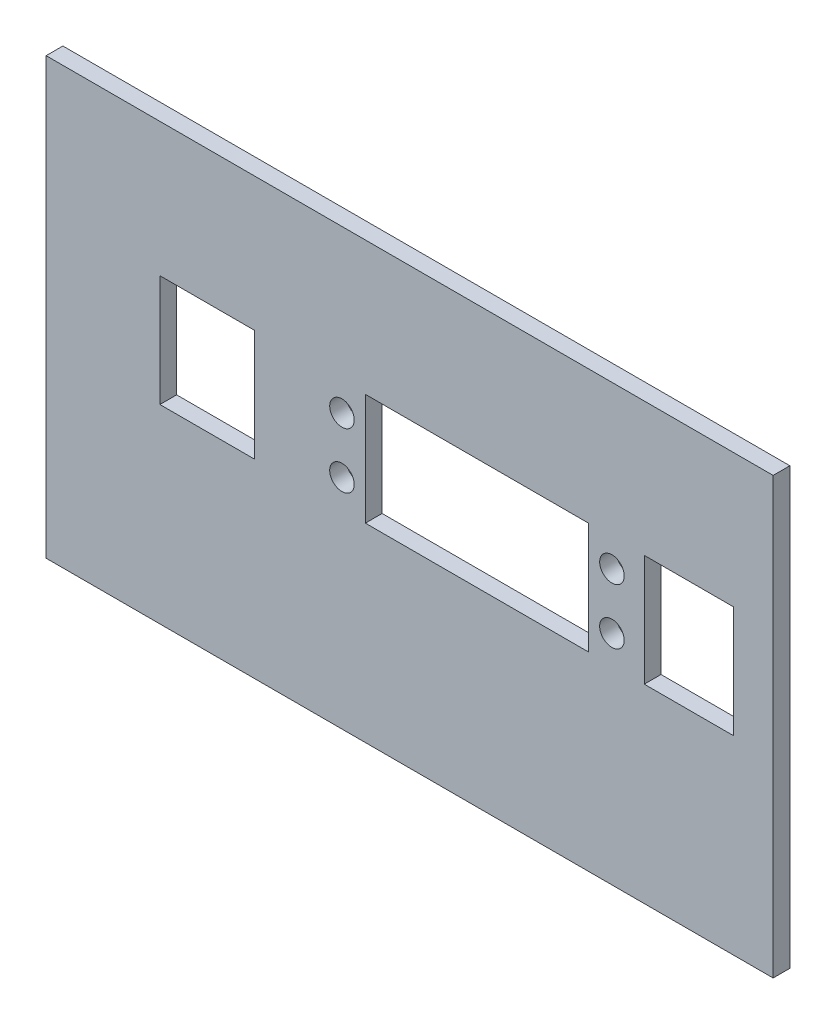
ISO-10303-21;
HEADER;
FILE_DESCRIPTION(('STEP AP214'),'2;1');
FILE_NAME('part.step','',(''),(''),'','','');
FILE_SCHEMA(('AUTOMOTIVE_DESIGN { 1 0 10303 214 1 1 1 1 }'));
ENDSEC;
DATA;
#1=APPLICATION_CONTEXT('core data for automotive mechanical design processes');
#2=APPLICATION_PROTOCOL_DEFINITION('international standard','automotive_design',2000,#1);
#3=PRODUCT_CONTEXT('',#1,'mechanical');
#4=PRODUCT('Part','Part','',(#3));
#5=PRODUCT_RELATED_PRODUCT_CATEGORY('part','',(#4));
#6=PRODUCT_DEFINITION_FORMATION('','',#4);
#7=PRODUCT_DEFINITION_CONTEXT('part definition',#1,'design');
#8=PRODUCT_DEFINITION('design','',#6,#7);
#9=PRODUCT_DEFINITION_SHAPE('','',#8);
#10=(LENGTH_UNIT() NAMED_UNIT(*) SI_UNIT(.MILLI.,.METRE.));
#11=(NAMED_UNIT(*) PLANE_ANGLE_UNIT() SI_UNIT($,.RADIAN.));
#12=(NAMED_UNIT(*) SI_UNIT($,.STERADIAN.) SOLID_ANGLE_UNIT());
#13=UNCERTAINTY_MEASURE_WITH_UNIT(LENGTH_MEASURE(1.E-05),#10,'distance_accuracy_value','');
#14=(GEOMETRIC_REPRESENTATION_CONTEXT(3) GLOBAL_UNCERTAINTY_ASSIGNED_CONTEXT((#13)) GLOBAL_UNIT_ASSIGNED_CONTEXT((#10,
#11,#12)) REPRESENTATION_CONTEXT('',''));
#15=CARTESIAN_POINT('',(0.,0.,0.));
#16=DIRECTION('',(0.,0.,1.));
#17=DIRECTION('',(1.,0.,0.));
#18=AXIS2_PLACEMENT_3D('',#15,#16,#17);
#19=CARTESIAN_POINT('',(0.,0.,1.5));
#20=DIRECTION('',(0.,0.,1.));
#21=DIRECTION('',(1.,0.,0.));
#22=AXIS2_PLACEMENT_3D('',#19,#20,#21);
#23=PLANE('',#22);
#24=DIRECTION('',(0.,-1.,0.));
#25=VECTOR('',#24,1.);
#26=CARTESIAN_POINT('',(-38.3962962829349,32.6887387273635,1.5));
#27=LINE('',#26,#25);
#28=CARTESIAN_POINT('',(-38.3962962829349,32.6887387273635,1.5));
#29=VERTEX_POINT('',#28);
#30=CARTESIAN_POINT('',(-38.3962962829349,-45.3491391233582,1.5));
#31=VERTEX_POINT('',#30);
#32=EDGE_CURVE('E318',#29,#31,#27,.T.);
#33=ORIENTED_EDGE('',*,*,#32,.T.);
#34=DIRECTION('',(1.,0.,0.));
#35=VECTOR('',#34,1.);
#36=CARTESIAN_POINT('',(-38.3962962829349,-45.3491391233582,1.5));
#37=LINE('',#36,#35);
#38=CARTESIAN_POINT('',(91.9435635315684,-45.3491391233582,1.5));
#39=VERTEX_POINT('',#38);
#40=EDGE_CURVE('E165',#31,#39,#37,.T.);
#41=ORIENTED_EDGE('',*,*,#40,.T.);
#42=DIRECTION('',(0.,1.,0.));
#43=VECTOR('',#42,1.);
#44=CARTESIAN_POINT('',(91.9435635315684,32.6887387273635,1.5));
#45=LINE('',#44,#43);
#46=CARTESIAN_POINT('',(91.9435635315684,32.6887387273635,1.5));
#47=VERTEX_POINT('',#46);
#48=EDGE_CURVE('E322',#39,#47,#45,.T.);
#49=ORIENTED_EDGE('',*,*,#48,.T.);
#50=DIRECTION('',(-1.,0.,0.));
#51=VECTOR('',#50,1.);
#52=CARTESIAN_POINT('',(-38.3962962829349,32.6887387273635,1.5));
#53=LINE('',#52,#51);
#54=EDGE_CURVE('E324',#47,#29,#53,.T.);
#55=ORIENTED_EDGE('',*,*,#54,.T.);
#56=EDGE_LOOP('',(#33,#41,#49,#55));
#57=FACE_BOUND('',#56,.T.);
#58=CARTESIAN_POINT('',(63.041461984655,3.72215593269896,1.5));
#59=DIRECTION('',(0.,0.,1.));
#60=DIRECTION('',(1.,0.,0.));
#61=AXIS2_PLACEMENT_3D('',#58,#59,#60);
#62=CIRCLE('',#61,2.2);
#63=CARTESIAN_POINT('',(65.241461984655,3.72215593269896,1.5));
#64=VERTEX_POINT('',#63);
#65=EDGE_CURVE('E269',#64,#64,#62,.T.);
#66=ORIENTED_EDGE('',*,*,#65,.F.);
#67=EDGE_LOOP('',(#66));
#68=FACE_BOUND('',#67,.T.);
#69=CARTESIAN_POINT('',(14.641461984655,-6.27784406730104,1.5));
#70=DIRECTION('',(0.,0.,1.));
#71=DIRECTION('',(1.,0.,0.));
#72=AXIS2_PLACEMENT_3D('',#69,#70,#71);
#73=CIRCLE('',#72,2.2);
#74=CARTESIAN_POINT('',(16.841461984655,-6.27784406730104,1.5));
#75=VERTEX_POINT('',#74);
#76=EDGE_CURVE('E281',#75,#75,#73,.T.);
#77=ORIENTED_EDGE('',*,*,#76,.F.);
#78=EDGE_LOOP('',(#77));
#79=FACE_BOUND('',#78,.T.);
#80=DIRECTION('',(-1.,0.,0.));
#81=VECTOR('',#80,1.);
#82=CARTESIAN_POINT('',(-0.999534143217308,8.72215593269896,1.5));
#83=LINE('',#82,#81);
#84=CARTESIAN_POINT('',(-0.999534143217308,8.72215593269896,1.5));
#85=VERTEX_POINT('',#84);
#86=CARTESIAN_POINT('',(-17.9995341432173,8.72215593269896,1.5));
#87=VERTEX_POINT('',#86);
#88=EDGE_CURVE('E289',#85,#87,#83,.T.);
#89=ORIENTED_EDGE('',*,*,#88,.F.);
#90=DIRECTION('',(0.,1.,0.));
#91=VECTOR('',#90,1.);
#92=CARTESIAN_POINT('',(-0.999534143217308,8.72215593269896,1.5));
#93=LINE('',#92,#91);
#94=CARTESIAN_POINT('',(-0.999534143217306,-11.27784407,1.5));
#95=VERTEX_POINT('',#94);
#96=EDGE_CURVE('E287',#95,#85,#93,.T.);
#97=ORIENTED_EDGE('',*,*,#96,.F.);
#98=DIRECTION('',(1.,0.,0.));
#99=VECTOR('',#98,1.);
#100=CARTESIAN_POINT('',(-0.999534143217306,-11.27784407,1.5));
#101=LINE('',#100,#99);
#102=CARTESIAN_POINT('',(-17.9995341432173,-11.27784407,1.5));
#103=VERTEX_POINT('',#102);
#104=EDGE_CURVE('E295',#103,#95,#101,.T.);
#105=ORIENTED_EDGE('',*,*,#104,.F.);
#106=DIRECTION('',(0.,-1.,0.));
#107=VECTOR('',#106,1.);
#108=CARTESIAN_POINT('',(-17.9995341432173,8.72215593269896,1.5));
#109=LINE('',#108,#107);
#110=EDGE_CURVE('E292',#87,#103,#109,.T.);
#111=ORIENTED_EDGE('',*,*,#110,.F.);
#112=EDGE_LOOP('',(#89,#97,#105,#111));
#113=FACE_BOUND('',#112,.T.);
#114=CARTESIAN_POINT('',(14.641461984655,3.72215593269896,1.5));
#115=DIRECTION('',(0.,0.,1.));
#116=DIRECTION('',(1.,0.,0.));
#117=AXIS2_PLACEMENT_3D('',#114,#115,#116);
#118=CIRCLE('',#117,2.2);
#119=CARTESIAN_POINT('',(16.841461984655,3.72215593269896,1.5));
#120=VERTEX_POINT('',#119);
#121=EDGE_CURVE('E275',#120,#120,#118,.T.);
#122=ORIENTED_EDGE('',*,*,#121,.F.);
#123=EDGE_LOOP('',(#122));
#124=FACE_BOUND('',#123,.T.);
#125=CARTESIAN_POINT('',(63.041461984655,-6.27784406730104,1.5));
#126=DIRECTION('',(0.,0.,1.));
#127=DIRECTION('',(1.,0.,0.));
#128=AXIS2_PLACEMENT_3D('',#125,#126,#127);
#129=CIRCLE('',#128,2.2);
#130=CARTESIAN_POINT('',(65.241461984655,-6.27784406730104,1.5));
#131=VERTEX_POINT('',#130);
#132=EDGE_CURVE('E263',#131,#131,#129,.T.);
#133=ORIENTED_EDGE('',*,*,#132,.F.);
#134=EDGE_LOOP('',(#133));
#135=FACE_BOUND('',#134,.T.);
#136=DIRECTION('',(0.,-1.,0.));
#137=VECTOR('',#136,1.);
#138=CARTESIAN_POINT('',(18.841461984655,8.72215593269896,1.5));
#139=LINE('',#138,#137);
#140=CARTESIAN_POINT('',(18.841461984655,8.72215593269896,1.5));
#141=VERTEX_POINT('',#140);
#142=CARTESIAN_POINT('',(18.841461984655,-11.277844067301,1.5));
#143=VERTEX_POINT('',#142);
#144=EDGE_CURVE('E234',#141,#143,#139,.T.);
#145=ORIENTED_EDGE('',*,*,#144,.F.);
#146=DIRECTION('',(-1.,0.,0.));
#147=VECTOR('',#146,1.);
#148=CARTESIAN_POINT('',(18.841461984655,8.72215593269896,1.5));
#149=LINE('',#148,#147);
#150=CARTESIAN_POINT('',(58.841461984655,8.72215593269896,1.5));
#151=VERTEX_POINT('',#150);
#152=EDGE_CURVE('E232',#151,#141,#149,.T.);
#153=ORIENTED_EDGE('',*,*,#152,.F.);
#154=DIRECTION('',(0.,1.,0.));
#155=VECTOR('',#154,1.);
#156=CARTESIAN_POINT('',(58.841461984655,8.72215593269896,1.5));
#157=LINE('',#156,#155);
#158=CARTESIAN_POINT('',(58.841461984655,-11.277844067301,1.5));
#159=VERTEX_POINT('',#158);
#160=EDGE_CURVE('E240',#159,#151,#157,.T.);
#161=ORIENTED_EDGE('',*,*,#160,.F.);
#162=DIRECTION('',(1.,0.,0.));
#163=VECTOR('',#162,1.);
#164=CARTESIAN_POINT('',(18.841461984655,-11.277844067301,1.5));
#165=LINE('',#164,#163);
#166=EDGE_CURVE('E237',#143,#159,#165,.T.);
#167=ORIENTED_EDGE('',*,*,#166,.F.);
#168=EDGE_LOOP('',(#145,#153,#161,#167));
#169=FACE_BOUND('',#168,.T.);
#170=DIRECTION('',(1.,0.,0.));
#171=VECTOR('',#170,1.);
#172=CARTESIAN_POINT('',(68.841461984655,-11.277844067301,1.5));
#173=LINE('',#172,#171);
#174=CARTESIAN_POINT('',(68.841461984655,-11.277844067301,1.5));
#175=VERTEX_POINT('',#174);
#176=CARTESIAN_POINT('',(84.841461984655,-11.277844067301,1.5));
#177=VERTEX_POINT('',#176);
#178=EDGE_CURVE('E205',#175,#177,#173,.T.);
#179=ORIENTED_EDGE('',*,*,#178,.F.);
#180=DIRECTION('',(0.,-1.,0.));
#181=VECTOR('',#180,1.);
#182=CARTESIAN_POINT('',(68.841461984655,-11.277844067301,1.5));
#183=LINE('',#182,#181);
#184=CARTESIAN_POINT('',(68.841461984655,8.72215593269896,1.5));
#185=VERTEX_POINT('',#184);
#186=EDGE_CURVE('E203',#185,#175,#183,.T.);
#187=ORIENTED_EDGE('',*,*,#186,.F.);
#188=DIRECTION('',(-1.,0.,0.));
#189=VECTOR('',#188,1.);
#190=CARTESIAN_POINT('',(68.841461984655,8.72215593269896,1.5));
#191=LINE('',#190,#189);
#192=CARTESIAN_POINT('',(84.841461984655,8.72215593269896,1.5));
#193=VERTEX_POINT('',#192);
#194=EDGE_CURVE('E210',#193,#185,#191,.T.);
#195=ORIENTED_EDGE('',*,*,#194,.F.);
#196=DIRECTION('',(0.,1.,0.));
#197=VECTOR('',#196,1.);
#198=CARTESIAN_POINT('',(84.841461984655,-11.277844067301,1.5));
#199=LINE('',#198,#197);
#200=EDGE_CURVE('E208',#177,#193,#199,.T.);
#201=ORIENTED_EDGE('',*,*,#200,.F.);
#202=EDGE_LOOP('',(#179,#187,#195,#201));
#203=FACE_BOUND('',#202,.T.);
#204=ADVANCED_FACE('F32',(#57,#68,#79,#113,#124,#135,#169,#203),#23,.T.);
#205=CARTESIAN_POINT('',(0.,0.,-1.5));
#206=DIRECTION('',(0.,0.,1.));
#207=DIRECTION('',(1.,0.,0.));
#208=AXIS2_PLACEMENT_3D('',#205,#206,#207);
#209=PLANE('',#208);
#210=DIRECTION('',(-1.,0.,0.));
#211=VECTOR('',#210,1.);
#212=CARTESIAN_POINT('',(18.841461984655,8.72215593269896,-1.5));
#213=LINE('',#212,#211);
#214=CARTESIAN_POINT('',(58.841461984655,8.72215593269896,-1.5));
#215=VERTEX_POINT('',#214);
#216=CARTESIAN_POINT('',(18.841461984655,8.72215593269896,-1.5));
#217=VERTEX_POINT('',#216);
#218=EDGE_CURVE('E231',#215,#217,#213,.T.);
#219=ORIENTED_EDGE('',*,*,#218,.T.);
#220=DIRECTION('',(0.,-1.,0.));
#221=VECTOR('',#220,1.);
#222=CARTESIAN_POINT('',(18.841461984655,8.72215593269896,-1.5));
#223=LINE('',#222,#221);
#224=CARTESIAN_POINT('',(18.841461984655,-11.277844067301,-1.5));
#225=VERTEX_POINT('',#224);
#226=EDGE_CURVE('E245',#217,#225,#223,.T.);
#227=ORIENTED_EDGE('',*,*,#226,.T.);
#228=DIRECTION('',(1.,0.,0.));
#229=VECTOR('',#228,1.);
#230=CARTESIAN_POINT('',(18.841461984655,-11.277844067301,-1.5));
#231=LINE('',#230,#229);
#232=CARTESIAN_POINT('',(58.841461984655,-11.277844067301,-1.5));
#233=VERTEX_POINT('',#232);
#234=EDGE_CURVE('E248',#225,#233,#231,.T.);
#235=ORIENTED_EDGE('',*,*,#234,.T.);
#236=DIRECTION('',(0.,1.,0.));
#237=VECTOR('',#236,1.);
#238=CARTESIAN_POINT('',(58.841461984655,8.72215593269896,-1.5));
#239=LINE('',#238,#237);
#240=EDGE_CURVE('E235',#233,#215,#239,.T.);
#241=ORIENTED_EDGE('',*,*,#240,.T.);
#242=EDGE_LOOP('',(#219,#227,#235,#241));
#243=FACE_BOUND('',#242,.T.);
#244=DIRECTION('',(0.,1.,0.));
#245=VECTOR('',#244,1.);
#246=CARTESIAN_POINT('',(81.6037037170651,0.,-1.5));
#247=LINE('',#246,#245);
#248=CARTESIAN_POINT('',(81.6037037170651,-45.3491391233582,-1.5));
#249=VERTEX_POINT('',#248);
#250=CARTESIAN_POINT('',(81.6037037170651,-42.3491391233582,-1.5));
#251=VERTEX_POINT('',#250);
#252=EDGE_CURVE('E192',#249,#251,#247,.T.);
#253=ORIENTED_EDGE('',*,*,#252,.T.);
#254=DIRECTION('',(-1.,0.,0.));
#255=VECTOR('',#254,1.);
#256=CARTESIAN_POINT('',(0.,-42.3491391233582,-1.5));
#257=LINE('',#256,#255);
#258=CARTESIAN_POINT('',(-38.3962962829349,-42.3491391233582,-1.5));
#259=VERTEX_POINT('',#258);
#260=EDGE_CURVE('E199',#251,#259,#257,.T.);
#261=ORIENTED_EDGE('',*,*,#260,.T.);
#262=DIRECTION('',(0.,-1.,0.));
#263=VECTOR('',#262,1.);
#264=CARTESIAN_POINT('',(-38.3962962829349,32.6887387273635,-1.5));
#265=LINE('',#264,#263);
#266=CARTESIAN_POINT('',(-38.3962962829349,32.6887387273635,-1.5));
#267=VERTEX_POINT('',#266);
#268=EDGE_CURVE('E317',#267,#259,#265,.T.);
#269=ORIENTED_EDGE('',*,*,#268,.F.);
#270=DIRECTION('',(-1.,0.,0.));
#271=VECTOR('',#270,1.);
#272=CARTESIAN_POINT('',(-38.3962962829349,32.6887387273635,-1.5));
#273=LINE('',#272,#271);
#274=CARTESIAN_POINT('',(91.9435635315684,32.6887387273635,-1.5));
#275=VERTEX_POINT('',#274);
#276=EDGE_CURVE('E320',#275,#267,#273,.T.);
#277=ORIENTED_EDGE('',*,*,#276,.F.);
#278=DIRECTION('',(0.,1.,0.));
#279=VECTOR('',#278,1.);
#280=CARTESIAN_POINT('',(91.9435635315684,32.6887387273635,-1.5));
#281=LINE('',#280,#279);
#282=CARTESIAN_POINT('',(91.9435635315684,-45.3491391233582,-1.5));
#283=VERTEX_POINT('',#282);
#284=EDGE_CURVE('E330',#283,#275,#281,.T.);
#285=ORIENTED_EDGE('',*,*,#284,.F.);
#286=DIRECTION('',(1.,0.,0.));
#287=VECTOR('',#286,1.);
#288=CARTESIAN_POINT('',(-38.3962962829349,-45.3491391233582,-1.5));
#289=LINE('',#288,#287);
#290=EDGE_CURVE('E328',#249,#283,#289,.T.);
#291=ORIENTED_EDGE('',*,*,#290,.F.);
#292=EDGE_LOOP('',(#253,#261,#269,#277,#285,#291));
#293=FACE_BOUND('',#292,.T.);
#294=DIRECTION('',(0.,1.,0.));
#295=VECTOR('',#294,1.);
#296=CARTESIAN_POINT('',(-0.999534143217308,8.72215593269896,-1.5));
#297=LINE('',#296,#295);
#298=CARTESIAN_POINT('',(-0.999534143217306,-11.27784407,-1.5));
#299=VERTEX_POINT('',#298);
#300=CARTESIAN_POINT('',(-0.999534143217308,8.72215593269896,-1.5));
#301=VERTEX_POINT('',#300);
#302=EDGE_CURVE('E284',#299,#301,#297,.T.);
#303=ORIENTED_EDGE('',*,*,#302,.T.);
#304=DIRECTION('',(-1.,0.,0.));
#305=VECTOR('',#304,1.);
#306=CARTESIAN_POINT('',(-0.999534143217308,8.72215593269896,-1.5));
#307=LINE('',#306,#305);
#308=CARTESIAN_POINT('',(-17.9995341432173,8.72215593269896,-1.5));
#309=VERTEX_POINT('',#308);
#310=EDGE_CURVE('E300',#301,#309,#307,.T.);
#311=ORIENTED_EDGE('',*,*,#310,.T.);
#312=DIRECTION('',(0.,-1.,0.));
#313=VECTOR('',#312,1.);
#314=CARTESIAN_POINT('',(-17.9995341432173,8.72215593269896,-1.5));
#315=LINE('',#314,#313);
#316=CARTESIAN_POINT('',(-17.9995341432173,-11.27784407,-1.5));
#317=VERTEX_POINT('',#316);
#318=EDGE_CURVE('E303',#309,#317,#315,.T.);
#319=ORIENTED_EDGE('',*,*,#318,.T.);
#320=DIRECTION('',(1.,0.,0.));
#321=VECTOR('',#320,1.);
#322=CARTESIAN_POINT('',(-0.999534143217306,-11.27784407,-1.5));
#323=LINE('',#322,#321);
#324=EDGE_CURVE('E290',#317,#299,#323,.T.);
#325=ORIENTED_EDGE('',*,*,#324,.T.);
#326=EDGE_LOOP('',(#303,#311,#319,#325));
#327=FACE_BOUND('',#326,.T.);
#328=CARTESIAN_POINT('',(14.641461984655,-6.27784406730104,-1.5));
#329=DIRECTION('',(0.,0.,1.));
#330=DIRECTION('',(1.,0.,0.));
#331=AXIS2_PLACEMENT_3D('',#328,#329,#330);
#332=CIRCLE('',#331,2.2);
#333=CARTESIAN_POINT('',(16.841461984655,-6.27784406730104,-1.5));
#334=VERTEX_POINT('',#333);
#335=EDGE_CURVE('E278',#334,#334,#332,.T.);
#336=ORIENTED_EDGE('',*,*,#335,.T.);
#337=EDGE_LOOP('',(#336));
#338=FACE_BOUND('',#337,.T.);
#339=CARTESIAN_POINT('',(14.641461984655,3.72215593269896,-1.5));
#340=DIRECTION('',(0.,0.,1.));
#341=DIRECTION('',(1.,0.,0.));
#342=AXIS2_PLACEMENT_3D('',#339,#340,#341);
#343=CIRCLE('',#342,2.2);
#344=CARTESIAN_POINT('',(16.841461984655,3.72215593269896,-1.5));
#345=VERTEX_POINT('',#344);
#346=EDGE_CURVE('E272',#345,#345,#343,.T.);
#347=ORIENTED_EDGE('',*,*,#346,.T.);
#348=EDGE_LOOP('',(#347));
#349=FACE_BOUND('',#348,.T.);
#350=CARTESIAN_POINT('',(63.041461984655,3.72215593269896,-1.5));
#351=DIRECTION('',(0.,0.,1.));
#352=DIRECTION('',(1.,0.,0.));
#353=AXIS2_PLACEMENT_3D('',#350,#351,#352);
#354=CIRCLE('',#353,2.2);
#355=CARTESIAN_POINT('',(65.241461984655,3.72215593269896,-1.5));
#356=VERTEX_POINT('',#355);
#357=EDGE_CURVE('E266',#356,#356,#354,.T.);
#358=ORIENTED_EDGE('',*,*,#357,.T.);
#359=EDGE_LOOP('',(#358));
#360=FACE_BOUND('',#359,.T.);
#361=CARTESIAN_POINT('',(63.041461984655,-6.27784406730104,-1.5));
#362=DIRECTION('',(0.,0.,1.));
#363=DIRECTION('',(1.,0.,0.));
#364=AXIS2_PLACEMENT_3D('',#361,#362,#363);
#365=CIRCLE('',#364,2.2);
#366=CARTESIAN_POINT('',(65.241461984655,-6.27784406730104,-1.5));
#367=VERTEX_POINT('',#366);
#368=EDGE_CURVE('E262',#367,#367,#365,.T.);
#369=ORIENTED_EDGE('',*,*,#368,.T.);
#370=EDGE_LOOP('',(#369));
#371=FACE_BOUND('',#370,.T.);
#372=DIRECTION('',(0.,-1.,0.));
#373=VECTOR('',#372,1.);
#374=CARTESIAN_POINT('',(68.841461984655,-11.277844067301,-1.5));
#375=LINE('',#374,#373);
#376=CARTESIAN_POINT('',(68.841461984655,8.72215593269896,-1.5));
#377=VERTEX_POINT('',#376);
#378=CARTESIAN_POINT('',(68.841461984655,-11.277844067301,-1.5));
#379=VERTEX_POINT('',#378);
#380=EDGE_CURVE('E202',#377,#379,#375,.T.);
#381=ORIENTED_EDGE('',*,*,#380,.T.);
#382=DIRECTION('',(1.,0.,0.));
#383=VECTOR('',#382,1.);
#384=CARTESIAN_POINT('',(68.841461984655,-11.277844067301,-1.5));
#385=LINE('',#384,#383);
#386=CARTESIAN_POINT('',(84.841461984655,-11.277844067301,-1.5));
#387=VERTEX_POINT('',#386);
#388=EDGE_CURVE('E215',#379,#387,#385,.T.);
#389=ORIENTED_EDGE('',*,*,#388,.T.);
#390=DIRECTION('',(0.,1.,0.));
#391=VECTOR('',#390,1.);
#392=CARTESIAN_POINT('',(84.841461984655,-11.277844067301,-1.5));
#393=LINE('',#392,#391);
#394=CARTESIAN_POINT('',(84.841461984655,8.72215593269896,-1.5));
#395=VERTEX_POINT('',#394);
#396=EDGE_CURVE('E218',#387,#395,#393,.T.);
#397=ORIENTED_EDGE('',*,*,#396,.T.);
#398=DIRECTION('',(-1.,0.,0.));
#399=VECTOR('',#398,1.);
#400=CARTESIAN_POINT('',(68.841461984655,8.72215593269896,-1.5));
#401=LINE('',#400,#399);
#402=EDGE_CURVE('E206',#395,#377,#401,.T.);
#403=ORIENTED_EDGE('',*,*,#402,.T.);
#404=EDGE_LOOP('',(#381,#389,#397,#403));
#405=FACE_BOUND('',#404,.T.);
#406=ADVANCED_FACE('F346',(#243,#293,#327,#338,#349,#360,#371,#405),#209,.F.);
#407=CARTESIAN_POINT('',(-38.3962962829349,32.6887387273635,1.5));
#408=DIRECTION('',(1.,0.,0.));
#409=DIRECTION('',(0.,1.,0.));
#410=AXIS2_PLACEMENT_3D('',#407,#408,#409);
#411=PLANE('',#410);
#412=ORIENTED_EDGE('',*,*,#268,.T.);
#413=DIRECTION('',(0.,0.,1.));
#414=VECTOR('',#413,1.);
#415=CARTESIAN_POINT('',(-38.3962962829349,-42.3491391233582,-7.5));
#416=LINE('',#415,#414);
#417=CARTESIAN_POINT('',(-38.3962962829349,-42.3491391233582,-7.5));
#418=VERTEX_POINT('',#417);
#419=EDGE_CURVE('E180',#418,#259,#416,.T.);
#420=ORIENTED_EDGE('',*,*,#419,.F.);
#421=DIRECTION('',(0.,-1.,0.));
#422=VECTOR('',#421,1.);
#423=CARTESIAN_POINT('',(-38.3962962829349,-42.3491391233582,-7.5));
#424=LINE('',#423,#422);
#425=CARTESIAN_POINT('',(-38.3962962829349,-45.3491391233582,-7.5));
#426=VERTEX_POINT('',#425);
#427=EDGE_CURVE('E174',#418,#426,#424,.T.);
#428=ORIENTED_EDGE('',*,*,#427,.T.);
#429=DIRECTION('',(0.,0.,-1.));
#430=VECTOR('',#429,1.);
#431=CARTESIAN_POINT('',(-38.3962962829349,-45.3491391233582,1.5));
#432=LINE('',#431,#430);
#433=EDGE_CURVE('E11',#31,#426,#432,.T.);
#434=ORIENTED_EDGE('',*,*,#433,.F.);
#435=ORIENTED_EDGE('',*,*,#32,.F.);
#436=DIRECTION('',(0.,0.,-1.));
#437=VECTOR('',#436,1.);
#438=CARTESIAN_POINT('',(-38.3962962829349,32.6887387273635,1.5));
#439=LINE('',#438,#437);
#440=EDGE_CURVE('E326',#29,#267,#439,.T.);
#441=ORIENTED_EDGE('',*,*,#440,.T.);
#442=EDGE_LOOP('',(#412,#420,#428,#434,#435,#441));
#443=FACE_BOUND('',#442,.T.);
#444=ADVANCED_FACE('F34',(#443),#411,.F.);
#445=CARTESIAN_POINT('',(-38.3962962829349,-45.3491391233582,1.5));
#446=DIRECTION('',(0.,1.,0.));
#447=DIRECTION('',(0.,0.,1.));
#448=AXIS2_PLACEMENT_3D('',#445,#446,#447);
#449=PLANE('',#448);
#450=CARTESIAN_POINT('',(-31.3962962829349,-45.3491391233582,-4.5));
#451=DIRECTION('',(0.,1.,0.));
#452=DIRECTION('',(0.,0.,1.));
#453=AXIS2_PLACEMENT_3D('',#450,#451,#452);
#454=CIRCLE('',#453,2.);
#455=CARTESIAN_POINT('',(-31.3962962829349,-45.3491391233582,-2.5));
#456=VERTEX_POINT('',#455);
#457=EDGE_CURVE('E181',#456,#456,#454,.T.);
#458=ORIENTED_EDGE('',*,*,#457,.T.);
#459=EDGE_LOOP('',(#458));
#460=FACE_BOUND('',#459,.T.);
#461=CARTESIAN_POINT('',(74.6037037170651,-45.3491391233582,-4.5));
#462=DIRECTION('',(0.,1.,0.));
#463=DIRECTION('',(0.,0.,1.));
#464=AXIS2_PLACEMENT_3D('',#461,#462,#463);
#465=CIRCLE('',#464,2.);
#466=CARTESIAN_POINT('',(74.6037037170651,-45.3491391233582,-2.5));
#467=VERTEX_POINT('',#466);
#468=EDGE_CURVE('E184',#467,#467,#465,.T.);
#469=ORIENTED_EDGE('',*,*,#468,.T.);
#470=EDGE_LOOP('',(#469));
#471=FACE_BOUND('',#470,.T.);
#472=DIRECTION('',(0.,0.,-1.));
#473=VECTOR('',#472,1.);
#474=CARTESIAN_POINT('',(91.9435635315684,-45.3491391233582,1.5));
#475=LINE('',#474,#473);
#476=EDGE_CURVE('E40',#39,#283,#475,.T.);
#477=ORIENTED_EDGE('',*,*,#476,.F.);
#478=ORIENTED_EDGE('',*,*,#40,.F.);
#479=ORIENTED_EDGE('',*,*,#433,.T.);
#480=DIRECTION('',(1.,0.,0.));
#481=VECTOR('',#480,1.);
#482=CARTESIAN_POINT('',(-38.3962962829349,-45.3491391233582,-7.5));
#483=LINE('',#482,#481);
#484=CARTESIAN_POINT('',(81.6037037170651,-45.3491391233582,-7.5));
#485=VERTEX_POINT('',#484);
#486=EDGE_CURVE('E164',#426,#485,#483,.T.);
#487=ORIENTED_EDGE('',*,*,#486,.T.);
#488=DIRECTION('',(0.,0.,1.));
#489=VECTOR('',#488,1.);
#490=CARTESIAN_POINT('',(81.6037037170651,-45.3491391233582,-7.5));
#491=LINE('',#490,#489);
#492=EDGE_CURVE('E47',#485,#249,#491,.T.);
#493=ORIENTED_EDGE('',*,*,#492,.T.);
#494=ORIENTED_EDGE('',*,*,#290,.T.);
#495=EDGE_LOOP('',(#477,#478,#479,#487,#493,#494));
#496=FACE_BOUND('',#495,.T.);
#497=ADVANCED_FACE('F163',(#460,#471,#496),#449,.F.);
#498=CARTESIAN_POINT('',(91.9435635315684,32.6887387273635,1.5));
#499=DIRECTION('',(-1.,0.,0.));
#500=DIRECTION('',(0.,0.,1.));
#501=AXIS2_PLACEMENT_3D('',#498,#499,#500);
#502=PLANE('',#501);
#503=ORIENTED_EDGE('',*,*,#284,.T.);
#504=DIRECTION('',(0.,0.,-1.));
#505=VECTOR('',#504,1.);
#506=CARTESIAN_POINT('',(91.9435635315684,32.6887387273635,1.5));
#507=LINE('',#506,#505);
#508=EDGE_CURVE('E335',#47,#275,#507,.T.);
#509=ORIENTED_EDGE('',*,*,#508,.F.);
#510=ORIENTED_EDGE('',*,*,#48,.F.);
#511=ORIENTED_EDGE('',*,*,#476,.T.);
#512=EDGE_LOOP('',(#503,#509,#510,#511));
#513=FACE_BOUND('',#512,.T.);
#514=ADVANCED_FACE('F341',(#513),#502,.F.);
#515=CARTESIAN_POINT('',(-38.3962962829349,32.6887387273635,1.5));
#516=DIRECTION('',(0.,-1.,0.));
#517=DIRECTION('',(0.,0.,-1.));
#518=AXIS2_PLACEMENT_3D('',#515,#516,#517);
#519=PLANE('',#518);
#520=ORIENTED_EDGE('',*,*,#276,.T.);
#521=ORIENTED_EDGE('',*,*,#440,.F.);
#522=ORIENTED_EDGE('',*,*,#54,.F.);
#523=ORIENTED_EDGE('',*,*,#508,.T.);
#524=EDGE_LOOP('',(#520,#521,#522,#523));
#525=FACE_BOUND('',#524,.T.);
#526=ADVANCED_FACE('F351',(#525),#519,.F.);
#527=CARTESIAN_POINT('',(-0.999534143217308,8.72215593269896,1.5));
#528=DIRECTION('',(-1.,0.,0.));
#529=DIRECTION('',(0.,-1.,0.));
#530=AXIS2_PLACEMENT_3D('',#527,#528,#529);
#531=PLANE('',#530);
#532=ORIENTED_EDGE('',*,*,#302,.F.);
#533=DIRECTION('',(0.,0.,-1.));
#534=VECTOR('',#533,1.);
#535=CARTESIAN_POINT('',(-0.999534143217306,-11.27784407,1.5));
#536=LINE('',#535,#534);
#537=EDGE_CURVE('E297',#95,#299,#536,.T.);
#538=ORIENTED_EDGE('',*,*,#537,.F.);
#539=ORIENTED_EDGE('',*,*,#96,.T.);
#540=DIRECTION('',(0.,0.,-1.));
#541=VECTOR('',#540,1.);
#542=CARTESIAN_POINT('',(-0.999534143217308,8.72215593269896,1.5));
#543=LINE('',#542,#541);
#544=EDGE_CURVE('E314',#85,#301,#543,.T.);
#545=ORIENTED_EDGE('',*,*,#544,.T.);
#546=EDGE_LOOP('',(#532,#538,#539,#545));
#547=FACE_BOUND('',#546,.T.);
#548=ADVANCED_FACE('F449',(#547),#531,.T.);
#549=CARTESIAN_POINT('',(-0.999534143217308,8.72215593269896,1.5));
#550=DIRECTION('',(0.,-1.,0.));
#551=DIRECTION('',(1.,0.,0.));
#552=AXIS2_PLACEMENT_3D('',#549,#550,#551);
#553=PLANE('',#552);
#554=ORIENTED_EDGE('',*,*,#310,.F.);
#555=ORIENTED_EDGE('',*,*,#544,.F.);
#556=ORIENTED_EDGE('',*,*,#88,.T.);
#557=DIRECTION('',(0.,0.,-1.));
#558=VECTOR('',#557,1.);
#559=CARTESIAN_POINT('',(-17.9995341432173,8.72215593269896,1.5));
#560=LINE('',#559,#558);
#561=EDGE_CURVE('E312',#87,#309,#560,.T.);
#562=ORIENTED_EDGE('',*,*,#561,.T.);
#563=EDGE_LOOP('',(#554,#555,#556,#562));
#564=FACE_BOUND('',#563,.T.);
#565=ADVANCED_FACE('F445',(#564),#553,.T.);
#566=CARTESIAN_POINT('',(-17.9995341432173,8.72215593269896,1.5));
#567=DIRECTION('',(1.,0.,0.));
#568=DIRECTION('',(0.,0.,-1.));
#569=AXIS2_PLACEMENT_3D('',#566,#567,#568);
#570=PLANE('',#569);
#571=ORIENTED_EDGE('',*,*,#318,.F.);
#572=ORIENTED_EDGE('',*,*,#561,.F.);
#573=ORIENTED_EDGE('',*,*,#110,.T.);
#574=DIRECTION('',(0.,0.,-1.));
#575=VECTOR('',#574,1.);
#576=CARTESIAN_POINT('',(-17.9995341432173,-11.27784407,1.5));
#577=LINE('',#576,#575);
#578=EDGE_CURVE('E310',#103,#317,#577,.T.);
#579=ORIENTED_EDGE('',*,*,#578,.T.);
#580=EDGE_LOOP('',(#571,#572,#573,#579));
#581=FACE_BOUND('',#580,.T.);
#582=ADVANCED_FACE('F441',(#581),#570,.T.);
#583=CARTESIAN_POINT('',(-0.999534143217306,-11.27784407,1.5));
#584=DIRECTION('',(0.,1.,0.));
#585=DIRECTION('',(-1.,0.,0.));
#586=AXIS2_PLACEMENT_3D('',#583,#584,#585);
#587=PLANE('',#586);
#588=ORIENTED_EDGE('',*,*,#324,.F.);
#589=ORIENTED_EDGE('',*,*,#578,.F.);
#590=ORIENTED_EDGE('',*,*,#104,.T.);
#591=ORIENTED_EDGE('',*,*,#537,.T.);
#592=EDGE_LOOP('',(#588,#589,#590,#591));
#593=FACE_BOUND('',#592,.T.);
#594=ADVANCED_FACE('F437',(#593),#587,.T.);
#595=CARTESIAN_POINT('',(14.641461984655,-6.27784406730104,1.5));
#596=DIRECTION('',(0.,0.,-1.));
#597=DIRECTION('',(-1.,0.,0.));
#598=AXIS2_PLACEMENT_3D('',#595,#596,#597);
#599=CYLINDRICAL_SURFACE('',#598,2.2);
#600=ORIENTED_EDGE('',*,*,#76,.T.);
#601=EDGE_LOOP('',(#600));
#602=FACE_BOUND('',#601,.T.);
#603=ORIENTED_EDGE('',*,*,#335,.F.);
#604=EDGE_LOOP('',(#603));
#605=FACE_BOUND('',#604,.T.);
#606=ADVANCED_FACE('F433',(#602,#605),#599,.F.);
#607=CARTESIAN_POINT('',(14.641461984655,3.72215593269896,1.5));
#608=DIRECTION('',(0.,0.,-1.));
#609=DIRECTION('',(-1.,0.,0.));
#610=AXIS2_PLACEMENT_3D('',#607,#608,#609);
#611=CYLINDRICAL_SURFACE('',#610,2.2);
#612=ORIENTED_EDGE('',*,*,#121,.T.);
#613=EDGE_LOOP('',(#612));
#614=FACE_BOUND('',#613,.T.);
#615=ORIENTED_EDGE('',*,*,#346,.F.);
#616=EDGE_LOOP('',(#615));
#617=FACE_BOUND('',#616,.T.);
#618=ADVANCED_FACE('F429',(#614,#617),#611,.F.);
#619=CARTESIAN_POINT('',(63.041461984655,3.72215593269896,1.5));
#620=DIRECTION('',(0.,0.,-1.));
#621=DIRECTION('',(-1.,0.,0.));
#622=AXIS2_PLACEMENT_3D('',#619,#620,#621);
#623=CYLINDRICAL_SURFACE('',#622,2.2);
#624=ORIENTED_EDGE('',*,*,#65,.T.);
#625=EDGE_LOOP('',(#624));
#626=FACE_BOUND('',#625,.T.);
#627=ORIENTED_EDGE('',*,*,#357,.F.);
#628=EDGE_LOOP('',(#627));
#629=FACE_BOUND('',#628,.T.);
#630=ADVANCED_FACE('F425',(#626,#629),#623,.F.);
#631=CARTESIAN_POINT('',(63.041461984655,-6.27784406730104,1.5));
#632=DIRECTION('',(0.,0.,-1.));
#633=DIRECTION('',(-1.,0.,0.));
#634=AXIS2_PLACEMENT_3D('',#631,#632,#633);
#635=CYLINDRICAL_SURFACE('',#634,2.2);
#636=ORIENTED_EDGE('',*,*,#132,.T.);
#637=EDGE_LOOP('',(#636));
#638=FACE_BOUND('',#637,.T.);
#639=ORIENTED_EDGE('',*,*,#368,.F.);
#640=EDGE_LOOP('',(#639));
#641=FACE_BOUND('',#640,.T.);
#642=ADVANCED_FACE('F421',(#638,#641),#635,.F.);
#643=CARTESIAN_POINT('',(18.841461984655,8.72215593269896,1.5));
#644=DIRECTION('',(0.,-1.,0.));
#645=DIRECTION('',(0.,0.,-1.));
#646=AXIS2_PLACEMENT_3D('',#643,#644,#645);
#647=PLANE('',#646);
#648=ORIENTED_EDGE('',*,*,#218,.F.);
#649=DIRECTION('',(0.,0.,-1.));
#650=VECTOR('',#649,1.);
#651=CARTESIAN_POINT('',(58.841461984655,8.72215593269896,1.5));
#652=LINE('',#651,#650);
#653=EDGE_CURVE('E242',#151,#215,#652,.T.);
#654=ORIENTED_EDGE('',*,*,#653,.F.);
#655=ORIENTED_EDGE('',*,*,#152,.T.);
#656=DIRECTION('',(0.,0.,-1.));
#657=VECTOR('',#656,1.);
#658=CARTESIAN_POINT('',(18.841461984655,8.72215593269896,1.5));
#659=LINE('',#658,#657);
#660=EDGE_CURVE('E259',#141,#217,#659,.T.);
#661=ORIENTED_EDGE('',*,*,#660,.T.);
#662=EDGE_LOOP('',(#648,#654,#655,#661));
#663=FACE_BOUND('',#662,.T.);
#664=ADVANCED_FACE('F417',(#663),#647,.T.);
#665=CARTESIAN_POINT('',(18.841461984655,8.72215593269896,1.5));
#666=DIRECTION('',(1.,0.,0.));
#667=DIRECTION('',(0.,1.,0.));
#668=AXIS2_PLACEMENT_3D('',#665,#666,#667);
#669=PLANE('',#668);
#670=ORIENTED_EDGE('',*,*,#226,.F.);
#671=ORIENTED_EDGE('',*,*,#660,.F.);
#672=ORIENTED_EDGE('',*,*,#144,.T.);
#673=DIRECTION('',(0.,0.,-1.));
#674=VECTOR('',#673,1.);
#675=CARTESIAN_POINT('',(18.841461984655,-11.277844067301,1.5));
#676=LINE('',#675,#674);
#677=EDGE_CURVE('E257',#143,#225,#676,.T.);
#678=ORIENTED_EDGE('',*,*,#677,.T.);
#679=EDGE_LOOP('',(#670,#671,#672,#678));
#680=FACE_BOUND('',#679,.T.);
#681=ADVANCED_FACE('F413',(#680),#669,.T.);
#682=CARTESIAN_POINT('',(18.841461984655,-11.277844067301,1.5));
#683=DIRECTION('',(0.,1.,0.));
#684=DIRECTION('',(0.,0.,1.));
#685=AXIS2_PLACEMENT_3D('',#682,#683,#684);
#686=PLANE('',#685);
#687=ORIENTED_EDGE('',*,*,#234,.F.);
#688=ORIENTED_EDGE('',*,*,#677,.F.);
#689=ORIENTED_EDGE('',*,*,#166,.T.);
#690=DIRECTION('',(0.,0.,-1.));
#691=VECTOR('',#690,1.);
#692=CARTESIAN_POINT('',(58.841461984655,-11.277844067301,1.5));
#693=LINE('',#692,#691);
#694=EDGE_CURVE('E255',#159,#233,#693,.T.);
#695=ORIENTED_EDGE('',*,*,#694,.T.);
#696=EDGE_LOOP('',(#687,#688,#689,#695));
#697=FACE_BOUND('',#696,.T.);
#698=ADVANCED_FACE('F409',(#697),#686,.T.);
#699=CARTESIAN_POINT('',(58.841461984655,8.72215593269896,1.5));
#700=DIRECTION('',(-1.,0.,0.));
#701=DIRECTION('',(0.,-1.,0.));
#702=AXIS2_PLACEMENT_3D('',#699,#700,#701);
#703=PLANE('',#702);
#704=ORIENTED_EDGE('',*,*,#240,.F.);
#705=ORIENTED_EDGE('',*,*,#694,.F.);
#706=ORIENTED_EDGE('',*,*,#160,.T.);
#707=ORIENTED_EDGE('',*,*,#653,.T.);
#708=EDGE_LOOP('',(#704,#705,#706,#707));
#709=FACE_BOUND('',#708,.T.);
#710=ADVANCED_FACE('F406',(#709),#703,.T.);
#711=CARTESIAN_POINT('',(68.841461984655,-11.277844067301,1.5));
#712=DIRECTION('',(1.,0.,0.));
#713=DIRECTION('',(0.,0.,-1.));
#714=AXIS2_PLACEMENT_3D('',#711,#712,#713);
#715=PLANE('',#714);
#716=ORIENTED_EDGE('',*,*,#380,.F.);
#717=DIRECTION('',(0.,0.,-1.));
#718=VECTOR('',#717,1.);
#719=CARTESIAN_POINT('',(68.841461984655,8.72215593269896,1.5));
#720=LINE('',#719,#718);
#721=EDGE_CURVE('E212',#185,#377,#720,.T.);
#722=ORIENTED_EDGE('',*,*,#721,.F.);
#723=ORIENTED_EDGE('',*,*,#186,.T.);
#724=DIRECTION('',(0.,0.,-1.));
#725=VECTOR('',#724,1.);
#726=CARTESIAN_POINT('',(68.841461984655,-11.277844067301,1.5));
#727=LINE('',#726,#725);
#728=EDGE_CURVE('E228',#175,#379,#727,.T.);
#729=ORIENTED_EDGE('',*,*,#728,.T.);
#730=EDGE_LOOP('',(#716,#722,#723,#729));
#731=FACE_BOUND('',#730,.T.);
#732=ADVANCED_FACE('F386',(#731),#715,.T.);
#733=CARTESIAN_POINT('',(68.841461984655,-11.277844067301,1.5));
#734=DIRECTION('',(0.,1.,0.));
#735=DIRECTION('',(0.,0.,1.));
#736=AXIS2_PLACEMENT_3D('',#733,#734,#735);
#737=PLANE('',#736);
#738=ORIENTED_EDGE('',*,*,#388,.F.);
#739=ORIENTED_EDGE('',*,*,#728,.F.);
#740=ORIENTED_EDGE('',*,*,#178,.T.);
#741=DIRECTION('',(0.,0.,-1.));
#742=VECTOR('',#741,1.);
#743=CARTESIAN_POINT('',(84.841461984655,-11.277844067301,1.5));
#744=LINE('',#743,#742);
#745=EDGE_CURVE('E226',#177,#387,#744,.T.);
#746=ORIENTED_EDGE('',*,*,#745,.T.);
#747=EDGE_LOOP('',(#738,#739,#740,#746));
#748=FACE_BOUND('',#747,.T.);
#749=ADVANCED_FACE('F380',(#748),#737,.T.);
#750=CARTESIAN_POINT('',(84.841461984655,-11.277844067301,1.5));
#751=DIRECTION('',(-1.,0.,0.));
#752=DIRECTION('',(0.,0.,1.));
#753=AXIS2_PLACEMENT_3D('',#750,#751,#752);
#754=PLANE('',#753);
#755=ORIENTED_EDGE('',*,*,#396,.F.);
#756=ORIENTED_EDGE('',*,*,#745,.F.);
#757=ORIENTED_EDGE('',*,*,#200,.T.);
#758=DIRECTION('',(0.,0.,-1.));
#759=VECTOR('',#758,1.);
#760=CARTESIAN_POINT('',(84.841461984655,8.72215593269896,1.5));
#761=LINE('',#760,#759);
#762=EDGE_CURVE('E55',#193,#395,#761,.T.);
#763=ORIENTED_EDGE('',*,*,#762,.T.);
#764=EDGE_LOOP('',(#755,#756,#757,#763));
#765=FACE_BOUND('',#764,.T.);
#766=ADVANCED_FACE('F383',(#765),#754,.T.);
#767=CARTESIAN_POINT('',(68.841461984655,8.72215593269896,1.5));
#768=DIRECTION('',(0.,-1.,0.));
#769=DIRECTION('',(0.,0.,-1.));
#770=AXIS2_PLACEMENT_3D('',#767,#768,#769);
#771=PLANE('',#770);
#772=ORIENTED_EDGE('',*,*,#402,.F.);
#773=ORIENTED_EDGE('',*,*,#762,.F.);
#774=ORIENTED_EDGE('',*,*,#194,.T.);
#775=ORIENTED_EDGE('',*,*,#721,.T.);
#776=EDGE_LOOP('',(#772,#773,#774,#775));
#777=FACE_BOUND('',#776,.T.);
#778=ADVANCED_FACE('F388',(#777),#771,.T.);
#779=CARTESIAN_POINT('',(81.6037037170651,-42.3491391233582,-7.5));
#780=DIRECTION('',(0.,1.,0.));
#781=DIRECTION('',(-1.,0.,0.));
#782=AXIS2_PLACEMENT_3D('',#779,#780,#781);
#783=PLANE('',#782);
#784=CARTESIAN_POINT('',(-31.3962962829349,-42.3491391233582,-4.5));
#785=DIRECTION('',(0.,1.,0.));
#786=DIRECTION('',(-1.,0.,0.));
#787=AXIS2_PLACEMENT_3D('',#784,#785,#786);
#788=CIRCLE('',#787,2.);
#789=CARTESIAN_POINT('',(-33.3962962829349,-42.3491391233582,-4.5));
#790=VERTEX_POINT('',#789);
#791=EDGE_CURVE('E470',#790,#790,#788,.T.);
#792=ORIENTED_EDGE('',*,*,#791,.F.);
#793=EDGE_LOOP('',(#792));
#794=FACE_BOUND('',#793,.T.);
#795=CARTESIAN_POINT('',(74.6037037170651,-42.3491391233582,-4.5));
#796=DIRECTION('',(0.,1.,0.));
#797=DIRECTION('',(-1.,0.,0.));
#798=AXIS2_PLACEMENT_3D('',#795,#796,#797);
#799=CIRCLE('',#798,2.);
#800=CARTESIAN_POINT('',(72.6037037170651,-42.3491391233582,-4.5));
#801=VERTEX_POINT('',#800);
#802=EDGE_CURVE('E472',#801,#801,#799,.T.);
#803=ORIENTED_EDGE('',*,*,#802,.F.);
#804=EDGE_LOOP('',(#803));
#805=FACE_BOUND('',#804,.T.);
#806=ORIENTED_EDGE('',*,*,#260,.F.);
#807=DIRECTION('',(0.,0.,1.));
#808=VECTOR('',#807,1.);
#809=CARTESIAN_POINT('',(81.6037037170651,-42.3491391233582,-7.5));
#810=LINE('',#809,#808);
#811=CARTESIAN_POINT('',(81.6037037170651,-42.3491391233582,-7.5));
#812=VERTEX_POINT('',#811);
#813=EDGE_CURVE('E193',#812,#251,#810,.T.);
#814=ORIENTED_EDGE('',*,*,#813,.F.);
#815=DIRECTION('',(-1.,0.,0.));
#816=VECTOR('',#815,1.);
#817=CARTESIAN_POINT('',(81.6037037170651,-42.3491391233582,-7.5));
#818=LINE('',#817,#816);
#819=EDGE_CURVE('E189',#812,#418,#818,.T.);
#820=ORIENTED_EDGE('',*,*,#819,.T.);
#821=ORIENTED_EDGE('',*,*,#419,.T.);
#822=EDGE_LOOP('',(#806,#814,#820,#821));
#823=FACE_BOUND('',#822,.T.);
#824=ADVANCED_FACE('F390',(#794,#805,#823),#783,.T.);
#825=CARTESIAN_POINT('',(81.6037037170651,-45.3491391233582,-7.5));
#826=DIRECTION('',(1.,0.,0.));
#827=DIRECTION('',(0.,0.,-1.));
#828=AXIS2_PLACEMENT_3D('',#825,#826,#827);
#829=PLANE('',#828);
#830=ORIENTED_EDGE('',*,*,#252,.F.);
#831=ORIENTED_EDGE('',*,*,#492,.F.);
#832=DIRECTION('',(0.,1.,0.));
#833=VECTOR('',#832,1.);
#834=CARTESIAN_POINT('',(81.6037037170651,-45.3491391233582,-7.5));
#835=LINE('',#834,#833);
#836=EDGE_CURVE('E177',#485,#812,#835,.T.);
#837=ORIENTED_EDGE('',*,*,#836,.T.);
#838=ORIENTED_EDGE('',*,*,#813,.T.);
#839=EDGE_LOOP('',(#830,#831,#837,#838));
#840=FACE_BOUND('',#839,.T.);
#841=ADVANCED_FACE('F396',(#840),#829,.T.);
#842=CARTESIAN_POINT('',(0.,0.,-7.5));
#843=DIRECTION('',(0.,0.,1.));
#844=DIRECTION('',(1.,0.,0.));
#845=AXIS2_PLACEMENT_3D('',#842,#843,#844);
#846=PLANE('',#845);
#847=ORIENTED_EDGE('',*,*,#427,.F.);
#848=ORIENTED_EDGE('',*,*,#819,.F.);
#849=ORIENTED_EDGE('',*,*,#836,.F.);
#850=ORIENTED_EDGE('',*,*,#486,.F.);
#851=EDGE_LOOP('',(#847,#848,#849,#850));
#852=FACE_BOUND('',#851,.T.);
#853=ADVANCED_FACE('F172',(#852),#846,.F.);
#854=CARTESIAN_POINT('',(74.6037037170651,-48.3491391233582,-4.5));
#855=DIRECTION('',(0.,1.,0.));
#856=DIRECTION('',(-1.,0.,0.));
#857=AXIS2_PLACEMENT_3D('',#854,#855,#856);
#858=CYLINDRICAL_SURFACE('',#857,2.);
#859=ORIENTED_EDGE('',*,*,#802,.T.);
#860=EDGE_LOOP('',(#859));
#861=FACE_BOUND('',#860,.T.);
#862=ORIENTED_EDGE('',*,*,#468,.F.);
#863=EDGE_LOOP('',(#862));
#864=FACE_BOUND('',#863,.T.);
#865=ADVANCED_FACE('F478',(#861,#864),#858,.F.);
#866=CARTESIAN_POINT('',(-31.3962962829349,-48.3491391233582,-4.5));
#867=DIRECTION('',(0.,1.,0.));
#868=DIRECTION('',(-1.,0.,0.));
#869=AXIS2_PLACEMENT_3D('',#866,#867,#868);
#870=CYLINDRICAL_SURFACE('',#869,2.);
#871=ORIENTED_EDGE('',*,*,#791,.T.);
#872=EDGE_LOOP('',(#871));
#873=FACE_BOUND('',#872,.T.);
#874=ORIENTED_EDGE('',*,*,#457,.F.);
#875=EDGE_LOOP('',(#874));
#876=FACE_BOUND('',#875,.T.);
#877=ADVANCED_FACE('F490',(#873,#876),#870,.F.);
#878=CLOSED_SHELL('',(#204,#406,#444,#497,#514,#526,#548,#565,#582,#594,#606,#618,#630,#642,
#664,#681,#698,#710,#732,#749,#766,#778,#824,#841,#853,#865,#877));
#879=MANIFOLD_SOLID_BREP('B2',#878);
#880=ADVANCED_BREP_SHAPE_REPRESENTATION('',(#18,#879),#14);
#881=SHAPE_DEFINITION_REPRESENTATION(#9,#880);
ENDSEC;
END-ISO-10303-21;
